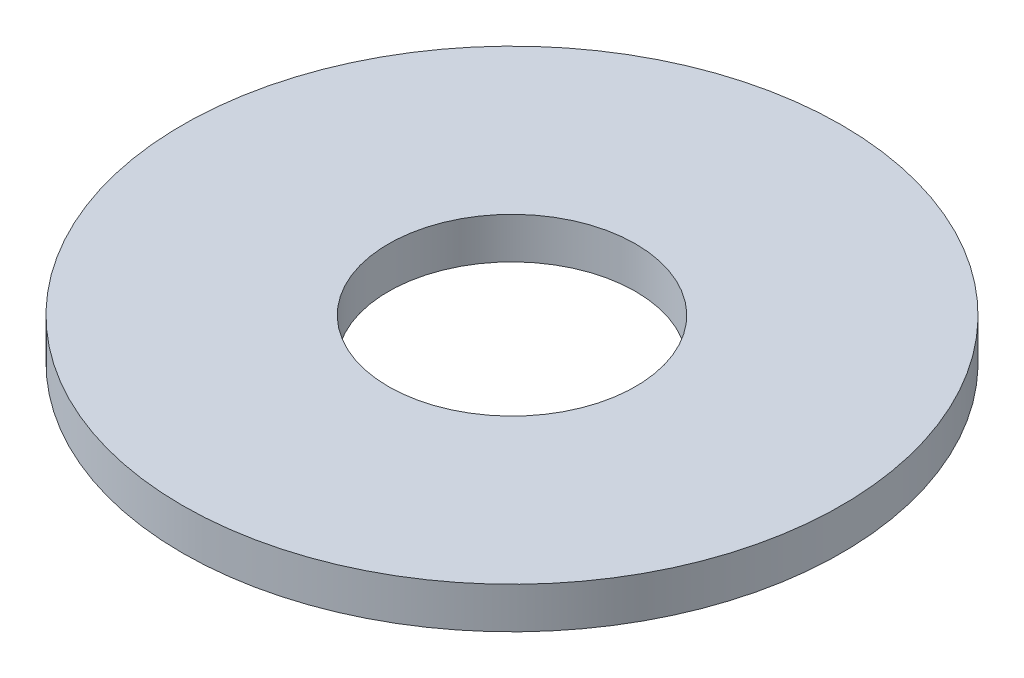
ISO-10303-21;
HEADER;
FILE_DESCRIPTION(('STEP AP214'),'2;1');
FILE_NAME('part.step','',(''),(''),'','','');
FILE_SCHEMA(('AUTOMOTIVE_DESIGN { 1 0 10303 214 1 1 1 1 }'));
ENDSEC;
DATA;
#1=APPLICATION_CONTEXT('core data for automotive mechanical design processes');
#2=APPLICATION_PROTOCOL_DEFINITION('international standard','automotive_design',2000,#1);
#3=PRODUCT_CONTEXT('',#1,'mechanical');
#4=PRODUCT('Part','Part','',(#3));
#5=PRODUCT_RELATED_PRODUCT_CATEGORY('part','',(#4));
#6=PRODUCT_DEFINITION_FORMATION('','',#4);
#7=PRODUCT_DEFINITION_CONTEXT('part definition',#1,'design');
#8=PRODUCT_DEFINITION('design','',#6,#7);
#9=PRODUCT_DEFINITION_SHAPE('','',#8);
#10=(LENGTH_UNIT() NAMED_UNIT(*) SI_UNIT(.MILLI.,.METRE.));
#11=(NAMED_UNIT(*) PLANE_ANGLE_UNIT() SI_UNIT($,.RADIAN.));
#12=(NAMED_UNIT(*) SI_UNIT($,.STERADIAN.) SOLID_ANGLE_UNIT());
#13=UNCERTAINTY_MEASURE_WITH_UNIT(LENGTH_MEASURE(1.E-05),#10,'distance_accuracy_value','');
#14=(GEOMETRIC_REPRESENTATION_CONTEXT(3) GLOBAL_UNCERTAINTY_ASSIGNED_CONTEXT((#13)) GLOBAL_UNIT_ASSIGNED_CONTEXT((#10,
#11,#12)) REPRESENTATION_CONTEXT('',''));
#15=CARTESIAN_POINT('',(0.,0.,0.));
#16=DIRECTION('',(0.,0.,1.));
#17=DIRECTION('',(1.,0.,0.));
#18=AXIS2_PLACEMENT_3D('',#15,#16,#17);
#19=CARTESIAN_POINT('',(0.,0.5,0.));
#20=DIRECTION('',(0.,1.,0.));
#21=DIRECTION('',(0.,0.,1.));
#22=AXIS2_PLACEMENT_3D('',#19,#20,#21);
#23=PLANE('',#22);
#24=CARTESIAN_POINT('',(0.,0.5,0.));
#25=DIRECTION('',(0.,1.,0.));
#26=DIRECTION('',(0.,0.,1.));
#27=AXIS2_PLACEMENT_3D('',#24,#25,#26);
#28=CIRCLE('',#27,4.);
#29=CARTESIAN_POINT('',(0.,0.5,4.));
#30=VERTEX_POINT('',#29);
#31=EDGE_CURVE('E10',#30,#30,#28,.T.);
#32=ORIENTED_EDGE('',*,*,#31,.T.);
#33=EDGE_LOOP('',(#32));
#34=FACE_BOUND('',#33,.T.);
#35=CARTESIAN_POINT('',(0.,0.5,0.));
#36=DIRECTION('',(0.,1.,0.));
#37=DIRECTION('',(0.,0.,1.));
#38=AXIS2_PLACEMENT_3D('',#35,#36,#37);
#39=CIRCLE('',#38,1.5);
#40=CARTESIAN_POINT('',(0.,0.5,1.5));
#41=VERTEX_POINT('',#40);
#42=EDGE_CURVE('E50',#41,#41,#39,.T.);
#43=ORIENTED_EDGE('',*,*,#42,.F.);
#44=EDGE_LOOP('',(#43));
#45=FACE_BOUND('',#44,.T.);
#46=ADVANCED_FACE('F39',(#34,#45),#23,.T.);
#47=CARTESIAN_POINT('',(0.,0.,0.));
#48=DIRECTION('',(0.,1.,0.));
#49=DIRECTION('',(0.,0.,1.));
#50=AXIS2_PLACEMENT_3D('',#47,#48,#49);
#51=PLANE('',#50);
#52=CARTESIAN_POINT('',(0.,0.,0.));
#53=DIRECTION('',(0.,1.,0.));
#54=DIRECTION('',(0.,0.,1.));
#55=AXIS2_PLACEMENT_3D('',#52,#53,#54);
#56=CIRCLE('',#55,4.);
#57=CARTESIAN_POINT('',(0.,0.,4.));
#58=VERTEX_POINT('',#57);
#59=EDGE_CURVE('E43',#58,#58,#56,.T.);
#60=ORIENTED_EDGE('',*,*,#59,.F.);
#61=EDGE_LOOP('',(#60));
#62=FACE_BOUND('',#61,.T.);
#63=CARTESIAN_POINT('',(0.,0.,0.));
#64=DIRECTION('',(0.,1.,0.));
#65=DIRECTION('',(0.,0.,1.));
#66=AXIS2_PLACEMENT_3D('',#63,#64,#65);
#67=CIRCLE('',#66,1.5);
#68=CARTESIAN_POINT('',(0.,0.,1.5));
#69=VERTEX_POINT('',#68);
#70=EDGE_CURVE('E52',#69,#69,#67,.T.);
#71=ORIENTED_EDGE('',*,*,#70,.T.);
#72=EDGE_LOOP('',(#71));
#73=FACE_BOUND('',#72,.T.);
#74=ADVANCED_FACE('F62',(#62,#73),#51,.F.);
#75=CARTESIAN_POINT('',(0.,0.5,0.));
#76=DIRECTION('',(0.,-1.,0.));
#77=DIRECTION('',(0.,0.,-1.));
#78=AXIS2_PLACEMENT_3D('',#75,#76,#77);
#79=CYLINDRICAL_SURFACE('',#78,4.);
#80=ORIENTED_EDGE('',*,*,#31,.F.);
#81=EDGE_LOOP('',(#80));
#82=FACE_BOUND('',#81,.T.);
#83=ORIENTED_EDGE('',*,*,#59,.T.);
#84=EDGE_LOOP('',(#83));
#85=FACE_BOUND('',#84,.T.);
#86=ADVANCED_FACE('F41',(#82,#85),#79,.T.);
#87=CARTESIAN_POINT('',(0.,0.5,0.));
#88=DIRECTION('',(0.,-1.,0.));
#89=DIRECTION('',(0.,0.,-1.));
#90=AXIS2_PLACEMENT_3D('',#87,#88,#89);
#91=CYLINDRICAL_SURFACE('',#90,1.5);
#92=ORIENTED_EDGE('',*,*,#42,.T.);
#93=EDGE_LOOP('',(#92));
#94=FACE_BOUND('',#93,.T.);
#95=ORIENTED_EDGE('',*,*,#70,.F.);
#96=EDGE_LOOP('',(#95));
#97=FACE_BOUND('',#96,.T.);
#98=ADVANCED_FACE('F58',(#94,#97),#91,.F.);
#99=CLOSED_SHELL('',(#46,#74,#86,#98));
#100=MANIFOLD_SOLID_BREP('B2',#99);
#101=ADVANCED_BREP_SHAPE_REPRESENTATION('',(#18,#100),#14);
#102=SHAPE_DEFINITION_REPRESENTATION(#9,#101);
ENDSEC;
END-ISO-10303-21;
